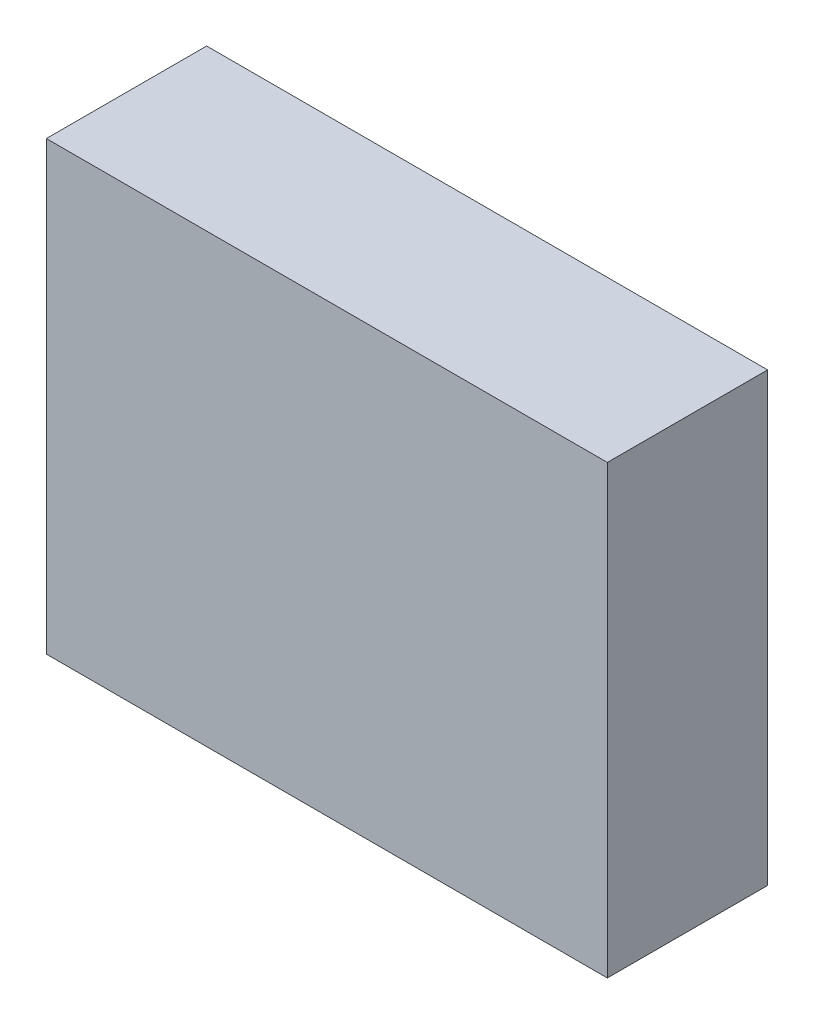
ISO-10303-21;
HEADER;
FILE_DESCRIPTION(('STEP AP214'),'2;1');
FILE_NAME('part.step','',(''),(''),'','','');
FILE_SCHEMA(('AUTOMOTIVE_DESIGN { 1 0 10303 214 1 1 1 1 }'));
ENDSEC;
DATA;
#1=APPLICATION_CONTEXT('core data for automotive mechanical design processes');
#2=APPLICATION_PROTOCOL_DEFINITION('international standard','automotive_design',2000,#1);
#3=PRODUCT_CONTEXT('',#1,'mechanical');
#4=PRODUCT('Part','Part','',(#3));
#5=PRODUCT_RELATED_PRODUCT_CATEGORY('part','',(#4));
#6=PRODUCT_DEFINITION_FORMATION('','',#4);
#7=PRODUCT_DEFINITION_CONTEXT('part definition',#1,'design');
#8=PRODUCT_DEFINITION('design','',#6,#7);
#9=PRODUCT_DEFINITION_SHAPE('','',#8);
#10=(LENGTH_UNIT() NAMED_UNIT(*) SI_UNIT(.MILLI.,.METRE.));
#11=(NAMED_UNIT(*) PLANE_ANGLE_UNIT() SI_UNIT($,.RADIAN.));
#12=(NAMED_UNIT(*) SI_UNIT($,.STERADIAN.) SOLID_ANGLE_UNIT());
#13=UNCERTAINTY_MEASURE_WITH_UNIT(LENGTH_MEASURE(1.E-05),#10,'distance_accuracy_value','');
#14=(GEOMETRIC_REPRESENTATION_CONTEXT(3) GLOBAL_UNCERTAINTY_ASSIGNED_CONTEXT((#13)) GLOBAL_UNIT_ASSIGNED_CONTEXT((#10,
#11,#12)) REPRESENTATION_CONTEXT('',''));
#15=CARTESIAN_POINT('',(0.,0.,0.));
#16=DIRECTION('',(0.,0.,1.));
#17=DIRECTION('',(1.,0.,0.));
#18=AXIS2_PLACEMENT_3D('',#15,#16,#17);
#19=CARTESIAN_POINT('',(2.45,1.95,1.4));
#20=DIRECTION('',(-1.,0.,0.));
#21=DIRECTION('',(0.,0.,1.));
#22=AXIS2_PLACEMENT_3D('',#19,#20,#21);
#23=PLANE('',#22);
#24=DIRECTION('',(0.,1.,0.));
#25=VECTOR('',#24,1.);
#26=CARTESIAN_POINT('',(2.45,1.95,0.));
#27=LINE('',#26,#25);
#28=CARTESIAN_POINT('',(2.45,-1.95,0.));
#29=VERTEX_POINT('',#28);
#30=CARTESIAN_POINT('',(2.45,1.95,0.));
#31=VERTEX_POINT('',#30);
#32=EDGE_CURVE('E97',#29,#31,#27,.T.);
#33=ORIENTED_EDGE('',*,*,#32,.T.);
#34=DIRECTION('',(0.,0.,-1.));
#35=VECTOR('',#34,1.);
#36=CARTESIAN_POINT('',(2.45,1.95,1.4));
#37=LINE('',#36,#35);
#38=CARTESIAN_POINT('',(2.45,1.95,1.4));
#39=VERTEX_POINT('',#38);
#40=EDGE_CURVE('E11',#39,#31,#37,.T.);
#41=ORIENTED_EDGE('',*,*,#40,.F.);
#42=DIRECTION('',(0.,1.,0.));
#43=VECTOR('',#42,1.);
#44=CARTESIAN_POINT('',(2.45,1.95,1.4));
#45=LINE('',#44,#43);
#46=CARTESIAN_POINT('',(2.45,-1.95,1.4));
#47=VERTEX_POINT('',#46);
#48=EDGE_CURVE('E85',#47,#39,#45,.T.);
#49=ORIENTED_EDGE('',*,*,#48,.F.);
#50=DIRECTION('',(0.,0.,-1.));
#51=VECTOR('',#50,1.);
#52=CARTESIAN_POINT('',(2.45,-1.95,1.4));
#53=LINE('',#52,#51);
#54=EDGE_CURVE('E93',#47,#29,#53,.T.);
#55=ORIENTED_EDGE('',*,*,#54,.T.);
#56=EDGE_LOOP('',(#33,#41,#49,#55));
#57=FACE_BOUND('',#56,.T.);
#58=ADVANCED_FACE('F34',(#57),#23,.F.);
#59=CARTESIAN_POINT('',(-2.45,1.95,1.4));
#60=DIRECTION('',(0.,-1.,0.));
#61=DIRECTION('',(0.,0.,-1.));
#62=AXIS2_PLACEMENT_3D('',#59,#60,#61);
#63=PLANE('',#62);
#64=DIRECTION('',(-1.,0.,0.));
#65=VECTOR('',#64,1.);
#66=CARTESIAN_POINT('',(-2.45,1.95,0.));
#67=LINE('',#66,#65);
#68=CARTESIAN_POINT('',(-2.45,1.95,0.));
#69=VERTEX_POINT('',#68);
#70=EDGE_CURVE('E89',#31,#69,#67,.T.);
#71=ORIENTED_EDGE('',*,*,#70,.T.);
#72=DIRECTION('',(0.,0.,-1.));
#73=VECTOR('',#72,1.);
#74=CARTESIAN_POINT('',(-2.45,1.95,1.4));
#75=LINE('',#74,#73);
#76=CARTESIAN_POINT('',(-2.45,1.95,1.4));
#77=VERTEX_POINT('',#76);
#78=EDGE_CURVE('E42',#77,#69,#75,.T.);
#79=ORIENTED_EDGE('',*,*,#78,.F.);
#80=DIRECTION('',(-1.,0.,0.));
#81=VECTOR('',#80,1.);
#82=CARTESIAN_POINT('',(-2.45,1.95,1.4));
#83=LINE('',#82,#81);
#84=EDGE_CURVE('E80',#39,#77,#83,.T.);
#85=ORIENTED_EDGE('',*,*,#84,.F.);
#86=ORIENTED_EDGE('',*,*,#40,.T.);
#87=EDGE_LOOP('',(#71,#79,#85,#86));
#88=FACE_BOUND('',#87,.T.);
#89=ADVANCED_FACE('F88',(#88),#63,.F.);
#90=CARTESIAN_POINT('',(-2.45,1.95,1.4));
#91=DIRECTION('',(1.,0.,0.));
#92=DIRECTION('',(0.,0.,-1.));
#93=AXIS2_PLACEMENT_3D('',#90,#91,#92);
#94=PLANE('',#93);
#95=DIRECTION('',(0.,-1.,0.));
#96=VECTOR('',#95,1.);
#97=CARTESIAN_POINT('',(-2.45,1.95,0.));
#98=LINE('',#97,#96);
#99=CARTESIAN_POINT('',(-2.45,-1.95,0.));
#100=VERTEX_POINT('',#99);
#101=EDGE_CURVE('E67',#69,#100,#98,.T.);
#102=ORIENTED_EDGE('',*,*,#101,.T.);
#103=DIRECTION('',(0.,0.,-1.));
#104=VECTOR('',#103,1.);
#105=CARTESIAN_POINT('',(-2.45,-1.95,1.4));
#106=LINE('',#105,#104);
#107=CARTESIAN_POINT('',(-2.45,-1.95,1.4));
#108=VERTEX_POINT('',#107);
#109=EDGE_CURVE('E90',#108,#100,#106,.T.);
#110=ORIENTED_EDGE('',*,*,#109,.F.);
#111=DIRECTION('',(0.,-1.,0.));
#112=VECTOR('',#111,1.);
#113=CARTESIAN_POINT('',(-2.45,1.95,1.4));
#114=LINE('',#113,#112);
#115=EDGE_CURVE('E83',#77,#108,#114,.T.);
#116=ORIENTED_EDGE('',*,*,#115,.F.);
#117=ORIENTED_EDGE('',*,*,#78,.T.);
#118=EDGE_LOOP('',(#102,#110,#116,#117));
#119=FACE_BOUND('',#118,.T.);
#120=ADVANCED_FACE('F91',(#119),#94,.F.);
#121=CARTESIAN_POINT('',(-2.45,-1.95,1.4));
#122=DIRECTION('',(0.,1.,0.));
#123=DIRECTION('',(0.,0.,1.));
#124=AXIS2_PLACEMENT_3D('',#121,#122,#123);
#125=PLANE('',#124);
#126=DIRECTION('',(1.,0.,0.));
#127=VECTOR('',#126,1.);
#128=CARTESIAN_POINT('',(-2.45,-1.95,0.));
#129=LINE('',#128,#127);
#130=EDGE_CURVE('E73',#100,#29,#129,.T.);
#131=ORIENTED_EDGE('',*,*,#130,.T.);
#132=ORIENTED_EDGE('',*,*,#54,.F.);
#133=DIRECTION('',(1.,0.,0.));
#134=VECTOR('',#133,1.);
#135=CARTESIAN_POINT('',(-2.45,-1.95,1.4));
#136=LINE('',#135,#134);
#137=EDGE_CURVE('E50',#108,#47,#136,.T.);
#138=ORIENTED_EDGE('',*,*,#137,.F.);
#139=ORIENTED_EDGE('',*,*,#109,.T.);
#140=EDGE_LOOP('',(#131,#132,#138,#139));
#141=FACE_BOUND('',#140,.T.);
#142=ADVANCED_FACE('F104',(#141),#125,.F.);
#143=CARTESIAN_POINT('',(0.,0.,1.4));
#144=DIRECTION('',(0.,0.,1.));
#145=DIRECTION('',(1.,0.,0.));
#146=AXIS2_PLACEMENT_3D('',#143,#144,#145);
#147=PLANE('',#146);
#148=ORIENTED_EDGE('',*,*,#48,.T.);
#149=ORIENTED_EDGE('',*,*,#84,.T.);
#150=ORIENTED_EDGE('',*,*,#115,.T.);
#151=ORIENTED_EDGE('',*,*,#137,.T.);
#152=EDGE_LOOP('',(#148,#149,#150,#151));
#153=FACE_BOUND('',#152,.T.);
#154=ADVANCED_FACE('F81',(#153),#147,.T.);
#155=CARTESIAN_POINT('',(0.,0.,0.));
#156=DIRECTION('',(0.,0.,1.));
#157=DIRECTION('',(1.,0.,0.));
#158=AXIS2_PLACEMENT_3D('',#155,#156,#157);
#159=PLANE('',#158);
#160=ORIENTED_EDGE('',*,*,#32,.F.);
#161=ORIENTED_EDGE('',*,*,#130,.F.);
#162=ORIENTED_EDGE('',*,*,#101,.F.);
#163=ORIENTED_EDGE('',*,*,#70,.F.);
#164=EDGE_LOOP('',(#160,#161,#162,#163));
#165=FACE_BOUND('',#164,.T.);
#166=ADVANCED_FACE('F107',(#165),#159,.F.);
#167=CLOSED_SHELL('',(#58,#89,#120,#142,#154,#166));
#168=MANIFOLD_SOLID_BREP('B2',#167);
#169=ADVANCED_BREP_SHAPE_REPRESENTATION('',(#18,#168),#14);
#170=SHAPE_DEFINITION_REPRESENTATION(#9,#169);
ENDSEC;
END-ISO-10303-21;
